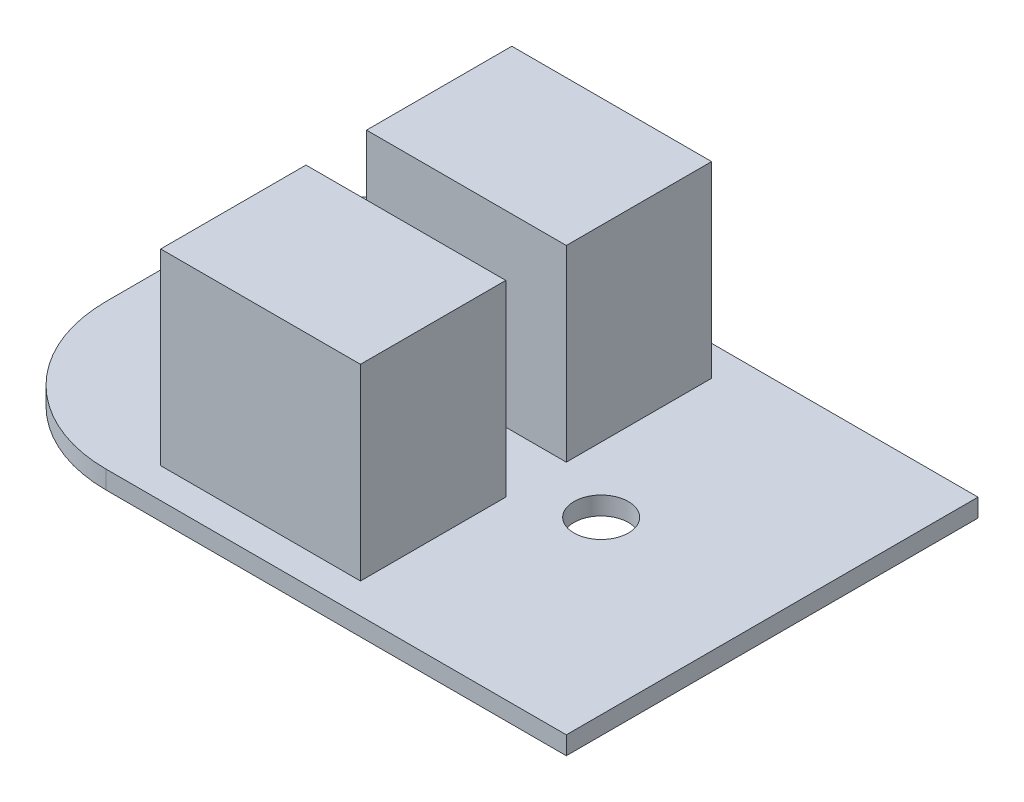
ISO-10303-21;
HEADER;
FILE_DESCRIPTION(('STEP AP214'),'2;1');
FILE_NAME('part.step','',(''),(''),'','','');
FILE_SCHEMA(('AUTOMOTIVE_DESIGN { 1 0 10303 214 1 1 1 1 }'));
ENDSEC;
DATA;
#1=APPLICATION_CONTEXT('core data for automotive mechanical design processes');
#2=APPLICATION_PROTOCOL_DEFINITION('international standard','automotive_design',2000,#1);
#3=PRODUCT_CONTEXT('',#1,'mechanical');
#4=PRODUCT('Part','Part','',(#3));
#5=PRODUCT_RELATED_PRODUCT_CATEGORY('part','',(#4));
#6=PRODUCT_DEFINITION_FORMATION('','',#4);
#7=PRODUCT_DEFINITION_CONTEXT('part definition',#1,'design');
#8=PRODUCT_DEFINITION('design','',#6,#7);
#9=PRODUCT_DEFINITION_SHAPE('','',#8);
#10=(LENGTH_UNIT() NAMED_UNIT(*) SI_UNIT(.MILLI.,.METRE.));
#11=(NAMED_UNIT(*) PLANE_ANGLE_UNIT() SI_UNIT($,.RADIAN.));
#12=(NAMED_UNIT(*) SI_UNIT($,.STERADIAN.) SOLID_ANGLE_UNIT());
#13=UNCERTAINTY_MEASURE_WITH_UNIT(LENGTH_MEASURE(1.E-05),#10,'distance_accuracy_value','');
#14=(GEOMETRIC_REPRESENTATION_CONTEXT(3) GLOBAL_UNCERTAINTY_ASSIGNED_CONTEXT((#13)) GLOBAL_UNIT_ASSIGNED_CONTEXT((#10,
#11,#12)) REPRESENTATION_CONTEXT('',''));
#15=CARTESIAN_POINT('',(0.,0.,0.));
#16=DIRECTION('',(0.,0.,1.));
#17=DIRECTION('',(1.,0.,0.));
#18=AXIS2_PLACEMENT_3D('',#15,#16,#17);
#19=CARTESIAN_POINT('',(0.,1.5,0.));
#20=DIRECTION('',(0.,1.,0.));
#21=DIRECTION('',(0.,0.,1.));
#22=AXIS2_PLACEMENT_3D('',#19,#20,#21);
#23=PLANE('',#22);
#24=CARTESIAN_POINT('',(8.04000000000001,1.5,17.));
#25=DIRECTION('',(0.,1.,0.));
#26=DIRECTION('',(0.,0.,1.));
#27=AXIS2_PLACEMENT_3D('',#24,#25,#26);
#28=CIRCLE('',#27,2.25);
#29=CARTESIAN_POINT('',(8.04000000000001,1.5,19.25));
#30=VERTEX_POINT('',#29);
#31=EDGE_CURVE('E195',#30,#30,#28,.T.);
#32=ORIENTED_EDGE('',*,*,#31,.F.);
#33=EDGE_LOOP('',(#32));
#34=FACE_BOUND('',#33,.T.);
#35=CARTESIAN_POINT('',(35.88,1.5,17.));
#36=DIRECTION('',(0.,1.,0.));
#37=DIRECTION('',(0.,0.,1.));
#38=AXIS2_PLACEMENT_3D('',#35,#36,#37);
#39=CIRCLE('',#38,2.25);
#40=CARTESIAN_POINT('',(35.88,1.5,19.25));
#41=VERTEX_POINT('',#40);
#42=EDGE_CURVE('E190',#41,#41,#39,.T.);
#43=ORIENTED_EDGE('',*,*,#42,.F.);
#44=EDGE_LOOP('',(#43));
#45=FACE_BOUND('',#44,.T.);
#46=DIRECTION('',(0.,0.,1.));
#47=VECTOR('',#46,1.);
#48=CARTESIAN_POINT('',(0.,1.5,0.));
#49=LINE('',#48,#47);
#50=CARTESIAN_POINT('',(0.,1.5,12.));
#51=VERTEX_POINT('',#50);
#52=CARTESIAN_POINT('',(0.,1.5,22.));
#53=VERTEX_POINT('',#52);
#54=EDGE_CURVE('E203',#51,#53,#49,.T.);
#55=ORIENTED_EDGE('',*,*,#54,.T.);
#56=CARTESIAN_POINT('',(12.,1.5,22.));
#57=DIRECTION('',(0.,1.,0.));
#58=DIRECTION('',(0.,0.,1.));
#59=AXIS2_PLACEMENT_3D('',#56,#57,#58);
#60=CIRCLE('',#59,12.);
#61=CARTESIAN_POINT('',(12.,1.5,34.));
#62=VERTEX_POINT('',#61);
#63=EDGE_CURVE('E41',#53,#62,#60,.T.);
#64=ORIENTED_EDGE('',*,*,#63,.T.);
#65=DIRECTION('',(1.,0.,0.));
#66=VECTOR('',#65,1.);
#67=CARTESIAN_POINT('',(0.,1.5,34.));
#68=LINE('',#67,#66);
#69=CARTESIAN_POINT('',(50.,1.5,34.));
#70=VERTEX_POINT('',#69);
#71=EDGE_CURVE('E206',#62,#70,#68,.T.);
#72=ORIENTED_EDGE('',*,*,#71,.T.);
#73=DIRECTION('',(0.,0.,-1.));
#74=VECTOR('',#73,1.);
#75=CARTESIAN_POINT('',(50.,1.5,0.));
#76=LINE('',#75,#74);
#77=CARTESIAN_POINT('',(50.,1.5,0.));
#78=VERTEX_POINT('',#77);
#79=EDGE_CURVE('E209',#70,#78,#76,.T.);
#80=ORIENTED_EDGE('',*,*,#79,.T.);
#81=DIRECTION('',(-1.,0.,0.));
#82=VECTOR('',#81,1.);
#83=CARTESIAN_POINT('',(0.,1.5,0.));
#84=LINE('',#83,#82);
#85=CARTESIAN_POINT('',(12.,1.5,0.));
#86=VERTEX_POINT('',#85);
#87=EDGE_CURVE('E211',#78,#86,#84,.T.);
#88=ORIENTED_EDGE('',*,*,#87,.T.);
#89=CARTESIAN_POINT('',(12.,1.5,12.));
#90=DIRECTION('',(0.,1.,0.));
#91=DIRECTION('',(0.,0.,1.));
#92=AXIS2_PLACEMENT_3D('',#89,#90,#91);
#93=CIRCLE('',#92,12.);
#94=EDGE_CURVE('E240',#86,#51,#93,.T.);
#95=ORIENTED_EDGE('',*,*,#94,.T.);
#96=EDGE_LOOP('',(#55,#64,#72,#80,#88,#95));
#97=FACE_BOUND('',#96,.T.);
#98=DIRECTION('',(1.,0.,0.));
#99=VECTOR('',#98,1.);
#100=CARTESIAN_POINT('',(14.,1.5,14.5));
#101=LINE('',#100,#99);
#102=CARTESIAN_POINT('',(14.,1.5,14.5));
#103=VERTEX_POINT('',#102);
#104=CARTESIAN_POINT('',(30.5,1.5,14.5));
#105=VERTEX_POINT('',#104);
#106=EDGE_CURVE('E162',#103,#105,#101,.T.);
#107=ORIENTED_EDGE('',*,*,#106,.F.);
#108=DIRECTION('',(0.,0.,1.));
#109=VECTOR('',#108,1.);
#110=CARTESIAN_POINT('',(14.,1.5,2.5));
#111=LINE('',#110,#109);
#112=CARTESIAN_POINT('',(14.,1.5,2.5));
#113=VERTEX_POINT('',#112);
#114=EDGE_CURVE('E159',#113,#103,#111,.T.);
#115=ORIENTED_EDGE('',*,*,#114,.F.);
#116=DIRECTION('',(-1.,0.,0.));
#117=VECTOR('',#116,1.);
#118=CARTESIAN_POINT('',(14.,1.5,2.5));
#119=LINE('',#118,#117);
#120=CARTESIAN_POINT('',(30.5,1.5,2.5));
#121=VERTEX_POINT('',#120);
#122=EDGE_CURVE('E171',#121,#113,#119,.T.);
#123=ORIENTED_EDGE('',*,*,#122,.F.);
#124=DIRECTION('',(0.,0.,-1.));
#125=VECTOR('',#124,1.);
#126=CARTESIAN_POINT('',(30.5,1.5,2.5));
#127=LINE('',#126,#125);
#128=EDGE_CURVE('E179',#105,#121,#127,.T.);
#129=ORIENTED_EDGE('',*,*,#128,.F.);
#130=EDGE_LOOP('',(#107,#115,#123,#129));
#131=FACE_BOUND('',#130,.T.);
#132=DIRECTION('',(0.,0.,-1.));
#133=VECTOR('',#132,1.);
#134=CARTESIAN_POINT('',(30.5,1.5,31.5));
#135=LINE('',#134,#133);
#136=CARTESIAN_POINT('',(30.5,1.5,31.5));
#137=VERTEX_POINT('',#136);
#138=CARTESIAN_POINT('',(30.5,1.5,19.5));
#139=VERTEX_POINT('',#138);
#140=EDGE_CURVE('E460',#137,#139,#135,.T.);
#141=ORIENTED_EDGE('',*,*,#140,.F.);
#142=DIRECTION('',(1.,0.,0.));
#143=VECTOR('',#142,1.);
#144=CARTESIAN_POINT('',(14.,1.5,31.5));
#145=LINE('',#144,#143);
#146=CARTESIAN_POINT('',(14.,1.5,31.5));
#147=VERTEX_POINT('',#146);
#148=EDGE_CURVE('E157',#147,#137,#145,.T.);
#149=ORIENTED_EDGE('',*,*,#148,.F.);
#150=DIRECTION('',(0.,0.,1.));
#151=VECTOR('',#150,1.);
#152=CARTESIAN_POINT('',(14.,1.5,31.5));
#153=LINE('',#152,#151);
#154=CARTESIAN_POINT('',(14.,1.5,19.5));
#155=VERTEX_POINT('',#154);
#156=EDGE_CURVE('E153',#155,#147,#153,.T.);
#157=ORIENTED_EDGE('',*,*,#156,.F.);
#158=DIRECTION('',(-1.,0.,0.));
#159=VECTOR('',#158,1.);
#160=CARTESIAN_POINT('',(14.,1.5,19.5));
#161=LINE('',#160,#159);
#162=EDGE_CURVE('E457',#139,#155,#161,.T.);
#163=ORIENTED_EDGE('',*,*,#162,.F.);
#164=EDGE_LOOP('',(#141,#149,#157,#163));
#165=FACE_BOUND('',#164,.T.);
#166=ADVANCED_FACE('F33',(#34,#45,#97,#131,#165),#23,.T.);
#167=CARTESIAN_POINT('',(0.,1.5,0.));
#168=DIRECTION('',(1.,0.,0.));
#169=DIRECTION('',(0.,0.,-1.));
#170=AXIS2_PLACEMENT_3D('',#167,#168,#169);
#171=PLANE('',#170);
#172=DIRECTION('',(0.,0.,1.));
#173=VECTOR('',#172,1.);
#174=CARTESIAN_POINT('',(0.,0.,0.));
#175=LINE('',#174,#173);
#176=CARTESIAN_POINT('',(0.,0.,12.));
#177=VERTEX_POINT('',#176);
#178=CARTESIAN_POINT('',(0.,0.,22.));
#179=VERTEX_POINT('',#178);
#180=EDGE_CURVE('E194',#177,#179,#175,.T.);
#181=ORIENTED_EDGE('',*,*,#180,.T.);
#182=DIRECTION('',(0.,-1.,0.));
#183=VECTOR('',#182,1.);
#184=CARTESIAN_POINT('',(0.,1.5,22.));
#185=LINE('',#184,#183);
#186=EDGE_CURVE('E238',#179,#53,#185,.F.);
#187=ORIENTED_EDGE('',*,*,#186,.T.);
#188=ORIENTED_EDGE('',*,*,#54,.F.);
#189=DIRECTION('',(0.,-1.,0.));
#190=VECTOR('',#189,1.);
#191=CARTESIAN_POINT('',(0.,1.5,12.));
#192=LINE('',#191,#190);
#193=EDGE_CURVE('E235',#51,#177,#192,.T.);
#194=ORIENTED_EDGE('',*,*,#193,.T.);
#195=EDGE_LOOP('',(#181,#187,#188,#194));
#196=FACE_BOUND('',#195,.T.);
#197=ADVANCED_FACE('F260',(#196),#171,.F.);
#198=CARTESIAN_POINT('',(0.,1.5,34.));
#199=DIRECTION('',(0.,0.,-1.));
#200=DIRECTION('',(-1.,0.,0.));
#201=AXIS2_PLACEMENT_3D('',#198,#199,#200);
#202=PLANE('',#201);
#203=ORIENTED_EDGE('',*,*,#71,.F.);
#204=DIRECTION('',(0.,-1.,0.));
#205=VECTOR('',#204,1.);
#206=CARTESIAN_POINT('',(12.,1.5,34.));
#207=LINE('',#206,#205);
#208=CARTESIAN_POINT('',(12.,0.,34.));
#209=VERTEX_POINT('',#208);
#210=EDGE_CURVE('E228',#62,#209,#207,.T.);
#211=ORIENTED_EDGE('',*,*,#210,.T.);
#212=DIRECTION('',(1.,0.,0.));
#213=VECTOR('',#212,1.);
#214=CARTESIAN_POINT('',(0.,0.,34.));
#215=LINE('',#214,#213);
#216=CARTESIAN_POINT('',(50.,0.,34.));
#217=VERTEX_POINT('',#216);
#218=EDGE_CURVE('E217',#209,#217,#215,.T.);
#219=ORIENTED_EDGE('',*,*,#218,.T.);
#220=DIRECTION('',(0.,-1.,0.));
#221=VECTOR('',#220,1.);
#222=CARTESIAN_POINT('',(50.,1.5,34.));
#223=LINE('',#222,#221);
#224=EDGE_CURVE('E225',#70,#217,#223,.T.);
#225=ORIENTED_EDGE('',*,*,#224,.F.);
#226=EDGE_LOOP('',(#203,#211,#219,#225));
#227=FACE_BOUND('',#226,.T.);
#228=ADVANCED_FACE('F251',(#227),#202,.F.);
#229=CARTESIAN_POINT('',(50.,1.5,0.));
#230=DIRECTION('',(-1.,0.,0.));
#231=DIRECTION('',(0.,0.,1.));
#232=AXIS2_PLACEMENT_3D('',#229,#230,#231);
#233=PLANE('',#232);
#234=DIRECTION('',(0.,0.,-1.));
#235=VECTOR('',#234,1.);
#236=CARTESIAN_POINT('',(50.,0.,0.));
#237=LINE('',#236,#235);
#238=CARTESIAN_POINT('',(50.,0.,0.));
#239=VERTEX_POINT('',#238);
#240=EDGE_CURVE('E219',#217,#239,#237,.T.);
#241=ORIENTED_EDGE('',*,*,#240,.T.);
#242=DIRECTION('',(0.,-1.,0.));
#243=VECTOR('',#242,1.);
#244=CARTESIAN_POINT('',(50.,1.5,0.));
#245=LINE('',#244,#243);
#246=EDGE_CURVE('E214',#78,#239,#245,.T.);
#247=ORIENTED_EDGE('',*,*,#246,.F.);
#248=ORIENTED_EDGE('',*,*,#79,.F.);
#249=ORIENTED_EDGE('',*,*,#224,.T.);
#250=EDGE_LOOP('',(#241,#247,#248,#249));
#251=FACE_BOUND('',#250,.T.);
#252=ADVANCED_FACE('F271',(#251),#233,.F.);
#253=CARTESIAN_POINT('',(0.,1.5,0.));
#254=DIRECTION('',(0.,0.,1.));
#255=DIRECTION('',(1.,0.,0.));
#256=AXIS2_PLACEMENT_3D('',#253,#254,#255);
#257=PLANE('',#256);
#258=DIRECTION('',(-1.,0.,0.));
#259=VECTOR('',#258,1.);
#260=CARTESIAN_POINT('',(0.,0.,0.));
#261=LINE('',#260,#259);
#262=CARTESIAN_POINT('',(12.,0.,0.));
#263=VERTEX_POINT('',#262);
#264=EDGE_CURVE('E207',#239,#263,#261,.T.);
#265=ORIENTED_EDGE('',*,*,#264,.T.);
#266=DIRECTION('',(0.,-1.,0.));
#267=VECTOR('',#266,1.);
#268=CARTESIAN_POINT('',(12.,1.5,0.));
#269=LINE('',#268,#267);
#270=EDGE_CURVE('E11',#263,#86,#269,.F.);
#271=ORIENTED_EDGE('',*,*,#270,.T.);
#272=ORIENTED_EDGE('',*,*,#87,.F.);
#273=ORIENTED_EDGE('',*,*,#246,.T.);
#274=EDGE_LOOP('',(#265,#271,#272,#273));
#275=FACE_BOUND('',#274,.T.);
#276=ADVANCED_FACE('F267',(#275),#257,.F.);
#277=CARTESIAN_POINT('',(0.,0.,0.));
#278=DIRECTION('',(0.,1.,0.));
#279=DIRECTION('',(0.,0.,1.));
#280=AXIS2_PLACEMENT_3D('',#277,#278,#279);
#281=PLANE('',#280);
#282=CARTESIAN_POINT('',(8.04000000000001,0.,17.));
#283=DIRECTION('',(0.,1.,0.));
#284=DIRECTION('',(0.,0.,1.));
#285=AXIS2_PLACEMENT_3D('',#282,#283,#284);
#286=CIRCLE('',#285,2.25);
#287=CARTESIAN_POINT('',(8.04000000000001,0.,19.25));
#288=VERTEX_POINT('',#287);
#289=EDGE_CURVE('E191',#288,#288,#286,.T.);
#290=ORIENTED_EDGE('',*,*,#289,.T.);
#291=EDGE_LOOP('',(#290));
#292=FACE_BOUND('',#291,.T.);
#293=CARTESIAN_POINT('',(35.88,0.,17.));
#294=DIRECTION('',(0.,1.,0.));
#295=DIRECTION('',(0.,0.,1.));
#296=AXIS2_PLACEMENT_3D('',#293,#294,#295);
#297=CIRCLE('',#296,2.25);
#298=CARTESIAN_POINT('',(35.88,0.,19.25));
#299=VERTEX_POINT('',#298);
#300=EDGE_CURVE('E198',#299,#299,#297,.T.);
#301=ORIENTED_EDGE('',*,*,#300,.T.);
#302=EDGE_LOOP('',(#301));
#303=FACE_BOUND('',#302,.T.);
#304=ORIENTED_EDGE('',*,*,#218,.F.);
#305=CARTESIAN_POINT('',(12.,0.,22.));
#306=DIRECTION('',(0.,1.,0.));
#307=DIRECTION('',(0.,0.,1.));
#308=AXIS2_PLACEMENT_3D('',#305,#306,#307);
#309=CIRCLE('',#308,12.);
#310=EDGE_CURVE('E233',#209,#179,#309,.F.);
#311=ORIENTED_EDGE('',*,*,#310,.T.);
#312=ORIENTED_EDGE('',*,*,#180,.F.);
#313=CARTESIAN_POINT('',(12.,0.,12.));
#314=DIRECTION('',(0.,1.,0.));
#315=DIRECTION('',(0.,0.,1.));
#316=AXIS2_PLACEMENT_3D('',#313,#314,#315);
#317=CIRCLE('',#316,12.);
#318=EDGE_CURVE('E231',#177,#263,#317,.F.);
#319=ORIENTED_EDGE('',*,*,#318,.T.);
#320=ORIENTED_EDGE('',*,*,#264,.F.);
#321=ORIENTED_EDGE('',*,*,#240,.F.);
#322=EDGE_LOOP('',(#304,#311,#312,#319,#320,#321));
#323=FACE_BOUND('',#322,.T.);
#324=ADVANCED_FACE('F257',(#292,#303,#323),#281,.F.);
#325=CARTESIAN_POINT('',(12.,1.5,22.));
#326=DIRECTION('',(0.,-1.,0.));
#327=DIRECTION('',(0.,0.,-1.));
#328=AXIS2_PLACEMENT_3D('',#325,#326,#327);
#329=CYLINDRICAL_SURFACE('',#328,12.);
#330=ORIENTED_EDGE('',*,*,#63,.F.);
#331=ORIENTED_EDGE('',*,*,#186,.F.);
#332=ORIENTED_EDGE('',*,*,#310,.F.);
#333=ORIENTED_EDGE('',*,*,#210,.F.);
#334=EDGE_LOOP('',(#330,#331,#332,#333));
#335=FACE_BOUND('',#334,.T.);
#336=ADVANCED_FACE('F254',(#335),#329,.T.);
#337=CARTESIAN_POINT('',(12.,1.5,12.));
#338=DIRECTION('',(0.,-1.,0.));
#339=DIRECTION('',(0.,0.,-1.));
#340=AXIS2_PLACEMENT_3D('',#337,#338,#339);
#341=CYLINDRICAL_SURFACE('',#340,12.);
#342=ORIENTED_EDGE('',*,*,#94,.F.);
#343=ORIENTED_EDGE('',*,*,#270,.F.);
#344=ORIENTED_EDGE('',*,*,#318,.F.);
#345=ORIENTED_EDGE('',*,*,#193,.F.);
#346=EDGE_LOOP('',(#342,#343,#344,#345));
#347=FACE_BOUND('',#346,.T.);
#348=ADVANCED_FACE('F35',(#347),#341,.T.);
#349=CARTESIAN_POINT('',(35.88,0.,17.));
#350=DIRECTION('',(0.,1.,0.));
#351=DIRECTION('',(0.,0.,1.));
#352=AXIS2_PLACEMENT_3D('',#349,#350,#351);
#353=CYLINDRICAL_SURFACE('',#352,2.25);
#354=ORIENTED_EDGE('',*,*,#300,.F.);
#355=EDGE_LOOP('',(#354));
#356=FACE_BOUND('',#355,.T.);
#357=ORIENTED_EDGE('',*,*,#42,.T.);
#358=EDGE_LOOP('',(#357));
#359=FACE_BOUND('',#358,.T.);
#360=ADVANCED_FACE('F291',(#356,#359),#353,.F.);
#361=CARTESIAN_POINT('',(8.04000000000001,0.,17.));
#362=DIRECTION('',(0.,1.,0.));
#363=DIRECTION('',(0.,0.,1.));
#364=AXIS2_PLACEMENT_3D('',#361,#362,#363);
#365=CYLINDRICAL_SURFACE('',#364,2.25);
#366=ORIENTED_EDGE('',*,*,#289,.F.);
#367=EDGE_LOOP('',(#366));
#368=FACE_BOUND('',#367,.T.);
#369=ORIENTED_EDGE('',*,*,#31,.T.);
#370=EDGE_LOOP('',(#369));
#371=FACE_BOUND('',#370,.T.);
#372=ADVANCED_FACE('F304',(#368,#371),#365,.F.);
#373=CARTESIAN_POINT('',(14.,17.,2.5));
#374=DIRECTION('',(1.,0.,0.));
#375=DIRECTION('',(0.,0.,-1.));
#376=AXIS2_PLACEMENT_3D('',#373,#374,#375);
#377=PLANE('',#376);
#378=ORIENTED_EDGE('',*,*,#114,.T.);
#379=DIRECTION('',(0.,-1.,0.));
#380=VECTOR('',#379,1.);
#381=CARTESIAN_POINT('',(14.,17.,14.5));
#382=LINE('',#381,#380);
#383=CARTESIAN_POINT('',(14.,17.,14.5));
#384=VERTEX_POINT('',#383);
#385=EDGE_CURVE('E188',#384,#103,#382,.T.);
#386=ORIENTED_EDGE('',*,*,#385,.F.);
#387=DIRECTION('',(0.,0.,1.));
#388=VECTOR('',#387,1.);
#389=CARTESIAN_POINT('',(14.,17.,2.5));
#390=LINE('',#389,#388);
#391=CARTESIAN_POINT('',(14.,17.,2.5));
#392=VERTEX_POINT('',#391);
#393=EDGE_CURVE('E167',#392,#384,#390,.T.);
#394=ORIENTED_EDGE('',*,*,#393,.F.);
#395=DIRECTION('',(0.,-1.,0.));
#396=VECTOR('',#395,1.);
#397=CARTESIAN_POINT('',(14.,17.,2.5));
#398=LINE('',#397,#396);
#399=EDGE_CURVE('E176',#392,#113,#398,.T.);
#400=ORIENTED_EDGE('',*,*,#399,.T.);
#401=EDGE_LOOP('',(#378,#386,#394,#400));
#402=FACE_BOUND('',#401,.T.);
#403=ADVANCED_FACE('F310',(#402),#377,.F.);
#404=CARTESIAN_POINT('',(14.,17.,14.5));
#405=DIRECTION('',(0.,0.,-1.));
#406=DIRECTION('',(-1.,0.,0.));
#407=AXIS2_PLACEMENT_3D('',#404,#405,#406);
#408=PLANE('',#407);
#409=ORIENTED_EDGE('',*,*,#106,.T.);
#410=DIRECTION('',(0.,-1.,0.));
#411=VECTOR('',#410,1.);
#412=CARTESIAN_POINT('',(30.5,17.,14.5));
#413=LINE('',#412,#411);
#414=CARTESIAN_POINT('',(30.5,17.,14.5));
#415=VERTEX_POINT('',#414);
#416=EDGE_CURVE('E185',#415,#105,#413,.T.);
#417=ORIENTED_EDGE('',*,*,#416,.F.);
#418=DIRECTION('',(1.,0.,0.));
#419=VECTOR('',#418,1.);
#420=CARTESIAN_POINT('',(14.,17.,14.5));
#421=LINE('',#420,#419);
#422=EDGE_CURVE('E170',#384,#415,#421,.T.);
#423=ORIENTED_EDGE('',*,*,#422,.F.);
#424=ORIENTED_EDGE('',*,*,#385,.T.);
#425=EDGE_LOOP('',(#409,#417,#423,#424));
#426=FACE_BOUND('',#425,.T.);
#427=ADVANCED_FACE('F367',(#426),#408,.F.);
#428=CARTESIAN_POINT('',(30.5,17.,2.5));
#429=DIRECTION('',(-1.,0.,0.));
#430=DIRECTION('',(0.,0.,1.));
#431=AXIS2_PLACEMENT_3D('',#428,#429,#430);
#432=PLANE('',#431);
#433=ORIENTED_EDGE('',*,*,#128,.T.);
#434=DIRECTION('',(0.,-1.,0.));
#435=VECTOR('',#434,1.);
#436=CARTESIAN_POINT('',(30.5,17.,2.5));
#437=LINE('',#436,#435);
#438=CARTESIAN_POINT('',(30.5,17.,2.5));
#439=VERTEX_POINT('',#438);
#440=EDGE_CURVE('E56',#439,#121,#437,.T.);
#441=ORIENTED_EDGE('',*,*,#440,.F.);
#442=DIRECTION('',(0.,0.,-1.));
#443=VECTOR('',#442,1.);
#444=CARTESIAN_POINT('',(30.5,17.,2.5));
#445=LINE('',#444,#443);
#446=EDGE_CURVE('E173',#415,#439,#445,.T.);
#447=ORIENTED_EDGE('',*,*,#446,.F.);
#448=ORIENTED_EDGE('',*,*,#416,.T.);
#449=EDGE_LOOP('',(#433,#441,#447,#448));
#450=FACE_BOUND('',#449,.T.);
#451=ADVANCED_FACE('F377',(#450),#432,.F.);
#452=CARTESIAN_POINT('',(14.,17.,2.5));
#453=DIRECTION('',(0.,0.,1.));
#454=DIRECTION('',(1.,0.,0.));
#455=AXIS2_PLACEMENT_3D('',#452,#453,#454);
#456=PLANE('',#455);
#457=ORIENTED_EDGE('',*,*,#122,.T.);
#458=ORIENTED_EDGE('',*,*,#399,.F.);
#459=DIRECTION('',(-1.,0.,0.));
#460=VECTOR('',#459,1.);
#461=CARTESIAN_POINT('',(14.,17.,2.5));
#462=LINE('',#461,#460);
#463=EDGE_CURVE('E175',#439,#392,#462,.T.);
#464=ORIENTED_EDGE('',*,*,#463,.F.);
#465=ORIENTED_EDGE('',*,*,#440,.T.);
#466=EDGE_LOOP('',(#457,#458,#464,#465));
#467=FACE_BOUND('',#466,.T.);
#468=ADVANCED_FACE('F387',(#467),#456,.F.);
#469=CARTESIAN_POINT('',(0.,17.,0.));
#470=DIRECTION('',(0.,1.,0.));
#471=DIRECTION('',(0.,0.,1.));
#472=AXIS2_PLACEMENT_3D('',#469,#470,#471);
#473=PLANE('',#472);
#474=ORIENTED_EDGE('',*,*,#393,.T.);
#475=ORIENTED_EDGE('',*,*,#422,.T.);
#476=ORIENTED_EDGE('',*,*,#446,.T.);
#477=ORIENTED_EDGE('',*,*,#463,.T.);
#478=EDGE_LOOP('',(#474,#475,#476,#477));
#479=FACE_BOUND('',#478,.T.);
#480=ADVANCED_FACE('F397',(#479),#473,.T.);
#481=CARTESIAN_POINT('',(14.,17.,31.5));
#482=DIRECTION('',(0.,0.,-1.));
#483=DIRECTION('',(-1.,0.,0.));
#484=AXIS2_PLACEMENT_3D('',#481,#482,#483);
#485=PLANE('',#484);
#486=ORIENTED_EDGE('',*,*,#148,.T.);
#487=DIRECTION('',(0.,-1.,0.));
#488=VECTOR('',#487,1.);
#489=CARTESIAN_POINT('',(30.5,17.,31.5));
#490=LINE('',#489,#488);
#491=CARTESIAN_POINT('',(30.5,17.,31.5));
#492=VERTEX_POINT('',#491);
#493=EDGE_CURVE('E138',#492,#137,#490,.T.);
#494=ORIENTED_EDGE('',*,*,#493,.F.);
#495=DIRECTION('',(1.,0.,0.));
#496=VECTOR('',#495,1.);
#497=CARTESIAN_POINT('',(14.,17.,31.5));
#498=LINE('',#497,#496);
#499=CARTESIAN_POINT('',(14.,17.,31.5));
#500=VERTEX_POINT('',#499);
#501=EDGE_CURVE('E145',#500,#492,#498,.T.);
#502=ORIENTED_EDGE('',*,*,#501,.F.);
#503=DIRECTION('',(0.,-1.,0.));
#504=VECTOR('',#503,1.);
#505=CARTESIAN_POINT('',(14.,17.,31.5));
#506=LINE('',#505,#504);
#507=EDGE_CURVE('E454',#500,#147,#506,.T.);
#508=ORIENTED_EDGE('',*,*,#507,.T.);
#509=EDGE_LOOP('',(#486,#494,#502,#508));
#510=FACE_BOUND('',#509,.T.);
#511=ADVANCED_FACE('F155',(#510),#485,.F.);
#512=CARTESIAN_POINT('',(30.5,17.,31.5));
#513=DIRECTION('',(-1.,0.,0.));
#514=DIRECTION('',(0.,0.,1.));
#515=AXIS2_PLACEMENT_3D('',#512,#513,#514);
#516=PLANE('',#515);
#517=ORIENTED_EDGE('',*,*,#140,.T.);
#518=DIRECTION('',(0.,-1.,0.));
#519=VECTOR('',#518,1.);
#520=CARTESIAN_POINT('',(30.5,17.,19.5));
#521=LINE('',#520,#519);
#522=CARTESIAN_POINT('',(30.5,17.,19.5));
#523=VERTEX_POINT('',#522);
#524=EDGE_CURVE('E141',#523,#139,#521,.T.);
#525=ORIENTED_EDGE('',*,*,#524,.F.);
#526=DIRECTION('',(0.,0.,-1.));
#527=VECTOR('',#526,1.);
#528=CARTESIAN_POINT('',(30.5,17.,31.5));
#529=LINE('',#528,#527);
#530=EDGE_CURVE('E134',#492,#523,#529,.T.);
#531=ORIENTED_EDGE('',*,*,#530,.F.);
#532=ORIENTED_EDGE('',*,*,#493,.T.);
#533=EDGE_LOOP('',(#517,#525,#531,#532));
#534=FACE_BOUND('',#533,.T.);
#535=ADVANCED_FACE('F136',(#534),#516,.F.);
#536=CARTESIAN_POINT('',(14.,17.,19.5));
#537=DIRECTION('',(0.,0.,1.));
#538=DIRECTION('',(1.,0.,0.));
#539=AXIS2_PLACEMENT_3D('',#536,#537,#538);
#540=PLANE('',#539);
#541=ORIENTED_EDGE('',*,*,#162,.T.);
#542=DIRECTION('',(0.,-1.,0.));
#543=VECTOR('',#542,1.);
#544=CARTESIAN_POINT('',(14.,17.,19.5));
#545=LINE('',#544,#543);
#546=CARTESIAN_POINT('',(14.,17.,19.5));
#547=VERTEX_POINT('',#546);
#548=EDGE_CURVE('E48',#547,#155,#545,.T.);
#549=ORIENTED_EDGE('',*,*,#548,.F.);
#550=DIRECTION('',(-1.,0.,0.));
#551=VECTOR('',#550,1.);
#552=CARTESIAN_POINT('',(14.,17.,19.5));
#553=LINE('',#552,#551);
#554=EDGE_CURVE('E144',#523,#547,#553,.T.);
#555=ORIENTED_EDGE('',*,*,#554,.F.);
#556=ORIENTED_EDGE('',*,*,#524,.T.);
#557=EDGE_LOOP('',(#541,#549,#555,#556));
#558=FACE_BOUND('',#557,.T.);
#559=ADVANCED_FACE('F423',(#558),#540,.F.);
#560=CARTESIAN_POINT('',(14.,17.,31.5));
#561=DIRECTION('',(1.,0.,0.));
#562=DIRECTION('',(0.,0.,-1.));
#563=AXIS2_PLACEMENT_3D('',#560,#561,#562);
#564=PLANE('',#563);
#565=ORIENTED_EDGE('',*,*,#156,.T.);
#566=ORIENTED_EDGE('',*,*,#507,.F.);
#567=DIRECTION('',(0.,0.,1.));
#568=VECTOR('',#567,1.);
#569=CARTESIAN_POINT('',(14.,17.,31.5));
#570=LINE('',#569,#568);
#571=EDGE_CURVE('E149',#547,#500,#570,.T.);
#572=ORIENTED_EDGE('',*,*,#571,.F.);
#573=ORIENTED_EDGE('',*,*,#548,.T.);
#574=EDGE_LOOP('',(#565,#566,#572,#573));
#575=FACE_BOUND('',#574,.T.);
#576=ADVANCED_FACE('F432',(#575),#564,.F.);
#577=CARTESIAN_POINT('',(0.,17.,0.));
#578=DIRECTION('',(0.,1.,0.));
#579=DIRECTION('',(0.,0.,1.));
#580=AXIS2_PLACEMENT_3D('',#577,#578,#579);
#581=PLANE('',#580);
#582=ORIENTED_EDGE('',*,*,#501,.T.);
#583=ORIENTED_EDGE('',*,*,#530,.T.);
#584=ORIENTED_EDGE('',*,*,#554,.T.);
#585=ORIENTED_EDGE('',*,*,#571,.T.);
#586=EDGE_LOOP('',(#582,#583,#584,#585));
#587=FACE_BOUND('',#586,.T.);
#588=ADVANCED_FACE('F148',(#587),#581,.T.);
#589=CLOSED_SHELL('',(#166,#197,#228,#252,#276,#324,#336,#348,#360,#372,#403,#427,#451,#468,
#480,#511,#535,#559,#576,#588));
#590=MANIFOLD_SOLID_BREP('B2',#589);
#591=ADVANCED_BREP_SHAPE_REPRESENTATION('',(#18,#590),#14);
#592=SHAPE_DEFINITION_REPRESENTATION(#9,#591);
ENDSEC;
END-ISO-10303-21;
